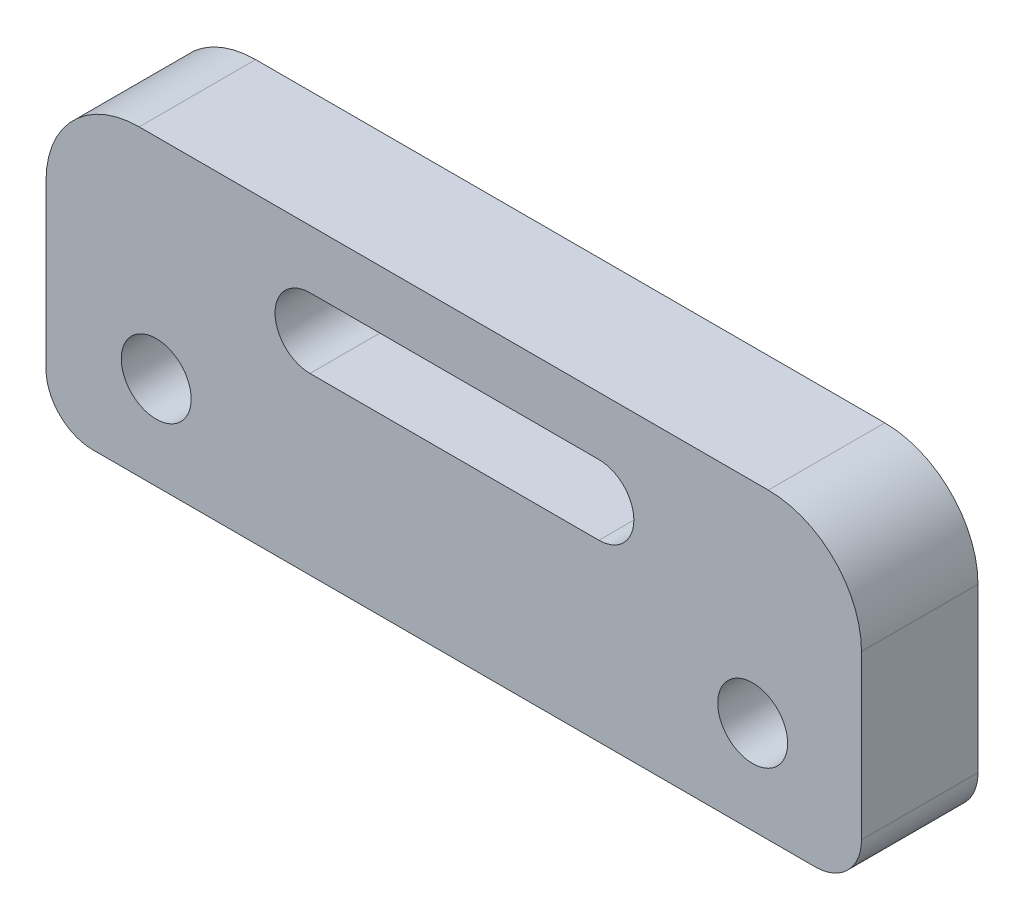
ISO-10303-21;
HEADER;
FILE_DESCRIPTION(('STEP AP214'),'2;1');
FILE_NAME('part.step','',(''),(''),'','','');
FILE_SCHEMA(('AUTOMOTIVE_DESIGN { 1 0 10303 214 1 1 1 1 }'));
ENDSEC;
DATA;
#1=APPLICATION_CONTEXT('core data for automotive mechanical design processes');
#2=APPLICATION_PROTOCOL_DEFINITION('international standard','automotive_design',2000,#1);
#3=PRODUCT_CONTEXT('',#1,'mechanical');
#4=PRODUCT('Part','Part','',(#3));
#5=PRODUCT_RELATED_PRODUCT_CATEGORY('part','',(#4));
#6=PRODUCT_DEFINITION_FORMATION('','',#4);
#7=PRODUCT_DEFINITION_CONTEXT('part definition',#1,'design');
#8=PRODUCT_DEFINITION('design','',#6,#7);
#9=PRODUCT_DEFINITION_SHAPE('','',#8);
#10=(LENGTH_UNIT() NAMED_UNIT(*) SI_UNIT(.MILLI.,.METRE.));
#11=(NAMED_UNIT(*) PLANE_ANGLE_UNIT() SI_UNIT($,.RADIAN.));
#12=(NAMED_UNIT(*) SI_UNIT($,.STERADIAN.) SOLID_ANGLE_UNIT());
#13=UNCERTAINTY_MEASURE_WITH_UNIT(LENGTH_MEASURE(1.E-05),#10,'distance_accuracy_value','');
#14=(GEOMETRIC_REPRESENTATION_CONTEXT(3) GLOBAL_UNCERTAINTY_ASSIGNED_CONTEXT((#13)) GLOBAL_UNIT_ASSIGNED_CONTEXT((#10,
#11,#12)) REPRESENTATION_CONTEXT('',''));
#15=CARTESIAN_POINT('',(0.,0.,0.));
#16=DIRECTION('',(0.,0.,1.));
#17=DIRECTION('',(1.,0.,0.));
#18=AXIS2_PLACEMENT_3D('',#15,#16,#17);
#19=CARTESIAN_POINT('',(16.2523833482388,-3.58106997579752,5.));
#20=DIRECTION('',(0.,0.,1.));
#21=DIRECTION('',(1.,0.,0.));
#22=AXIS2_PLACEMENT_3D('',#19,#20,#21);
#23=PLANE('',#22);
#24=CARTESIAN_POINT('',(13.5823831456504,-1.58016977928663,5.));
#25=DIRECTION('',(0.,0.,1.));
#26=DIRECTION('',(1.,0.,0.));
#27=AXIS2_PLACEMENT_3D('',#24,#25,#26);
#28=CIRCLE('',#27,1.5);
#29=CARTESIAN_POINT('',(15.0823831456504,-1.58016977928663,5.));
#30=VERTEX_POINT('',#29);
#31=EDGE_CURVE('E163',#30,#30,#28,.T.);
#32=ORIENTED_EDGE('',*,*,#31,.F.);
#33=EDGE_LOOP('',(#32));
#34=FACE_BOUND('',#33,.T.);
#35=CARTESIAN_POINT('',(16.2523833482388,-3.58106997579752,5.));
#36=DIRECTION('',(0.,0.,1.));
#37=DIRECTION('',(1.,0.,0.));
#38=AXIS2_PLACEMENT_3D('',#35,#36,#37);
#39=CIRCLE('',#38,2.00000000000002);
#40=CARTESIAN_POINT('',(16.3123831456501,-5.58016977928675,5.));
#41=VERTEX_POINT('',#40);
#42=CARTESIAN_POINT('',(18.2523831456504,-3.58016977928832,5.));
#43=VERTEX_POINT('',#42);
#44=EDGE_CURVE('E169',#41,#43,#39,.T.);
#45=ORIENTED_EDGE('',*,*,#44,.T.);
#46=DIRECTION('',(0.,1.,0.));
#47=VECTOR('',#46,1.);
#48=CARTESIAN_POINT('',(18.2523831456504,-3.58016977928832,5.));
#49=LINE('',#48,#47);
#50=CARTESIAN_POINT('',(18.2523831456504,3.4198302207103,5.));
#51=VERTEX_POINT('',#50);
#52=EDGE_CURVE('E172',#43,#51,#49,.T.);
#53=ORIENTED_EDGE('',*,*,#52,.T.);
#54=CARTESIAN_POINT('',(14.2523831456504,3.41983022071337,5.));
#55=DIRECTION('',(0.,0.,1.));
#56=DIRECTION('',(1.,0.,0.));
#57=AXIS2_PLACEMENT_3D('',#54,#55,#56);
#58=CIRCLE('',#57,4.);
#59=CARTESIAN_POINT('',(14.2523831456508,7.41983022071337,5.));
#60=VERTEX_POINT('',#59);
#61=EDGE_CURVE('E175',#51,#60,#58,.T.);
#62=ORIENTED_EDGE('',*,*,#61,.T.);
#63=DIRECTION('',(-1.,0.,0.));
#64=VECTOR('',#63,1.);
#65=CARTESIAN_POINT('',(-12.7476168543498,7.41983022071337,5.));
#66=LINE('',#65,#64);
#67=CARTESIAN_POINT('',(-12.7476168543498,7.41983022071337,5.));
#68=VERTEX_POINT('',#67);
#69=EDGE_CURVE('E177',#60,#68,#66,.T.);
#70=ORIENTED_EDGE('',*,*,#69,.T.);
#71=CARTESIAN_POINT('',(-12.7476168543498,3.41983022071335,5.));
#72=DIRECTION('',(0.,0.,1.));
#73=DIRECTION('',(1.,0.,0.));
#74=AXIS2_PLACEMENT_3D('',#71,#72,#73);
#75=CIRCLE('',#74,4.00000000000002);
#76=CARTESIAN_POINT('',(-16.7476168543498,3.41983022071336,5.));
#77=VERTEX_POINT('',#76);
#78=EDGE_CURVE('E179',#68,#77,#75,.T.);
#79=ORIENTED_EDGE('',*,*,#78,.T.);
#80=DIRECTION('',(0.,-1.,0.));
#81=VECTOR('',#80,1.);
#82=CARTESIAN_POINT('',(-16.7476168543498,3.41983022071336,5.));
#83=LINE('',#82,#81);
#84=CARTESIAN_POINT('',(-16.7476168543498,-3.58016977928677,5.));
#85=VERTEX_POINT('',#84);
#86=EDGE_CURVE('E181',#77,#85,#83,.T.);
#87=ORIENTED_EDGE('',*,*,#86,.T.);
#88=CARTESIAN_POINT('',(-14.7476168543498,-3.58016977928675,5.));
#89=DIRECTION('',(0.,0.,1.));
#90=DIRECTION('',(1.,0.,0.));
#91=AXIS2_PLACEMENT_3D('',#88,#89,#90);
#92=CIRCLE('',#91,2.);
#93=CARTESIAN_POINT('',(-14.7476168543493,-5.58016977928675,5.));
#94=VERTEX_POINT('',#93);
#95=EDGE_CURVE('E183',#85,#94,#92,.T.);
#96=ORIENTED_EDGE('',*,*,#95,.T.);
#97=DIRECTION('',(1.,0.,0.));
#98=VECTOR('',#97,1.);
#99=CARTESIAN_POINT('',(-14.7476168543493,-5.58016977928675,5.));
#100=LINE('',#99,#98);
#101=EDGE_CURVE('E185',#94,#41,#100,.T.);
#102=ORIENTED_EDGE('',*,*,#101,.T.);
#103=EDGE_LOOP('',(#45,#53,#62,#70,#79,#87,#96,#102));
#104=FACE_BOUND('',#103,.T.);
#105=CARTESIAN_POINT('',(-12.0176168543497,-1.58016977928663,5.));
#106=DIRECTION('',(0.,0.,1.));
#107=DIRECTION('',(1.,0.,0.));
#108=AXIS2_PLACEMENT_3D('',#105,#106,#107);
#109=CIRCLE('',#108,1.5);
#110=CARTESIAN_POINT('',(-10.5176168543497,-1.58016977928663,5.));
#111=VERTEX_POINT('',#110);
#112=EDGE_CURVE('E157',#111,#111,#109,.T.);
#113=ORIENTED_EDGE('',*,*,#112,.F.);
#114=EDGE_LOOP('',(#113));
#115=FACE_BOUND('',#114,.T.);
#116=DIRECTION('',(1.,0.,0.));
#117=VECTOR('',#116,1.);
#118=CARTESIAN_POINT('',(-5.41761685434961,1.91983022071337,5.));
#119=LINE('',#118,#117);
#120=CARTESIAN_POINT('',(-5.41761685434961,1.91983022071337,5.));
#121=VERTEX_POINT('',#120);
#122=CARTESIAN_POINT('',(6.98238314565039,1.91983022071351,5.));
#123=VERTEX_POINT('',#122);
#124=EDGE_CURVE('E129',#121,#123,#119,.T.);
#125=ORIENTED_EDGE('',*,*,#124,.F.);
#126=CARTESIAN_POINT('',(-5.41761685434961,3.41983022071337,5.));
#127=DIRECTION('',(0.,0.,1.));
#128=DIRECTION('',(1.,0.,0.));
#129=AXIS2_PLACEMENT_3D('',#126,#127,#128);
#130=CIRCLE('',#129,1.5);
#131=CARTESIAN_POINT('',(-5.41761685434961,4.91983022071337,5.));
#132=VERTEX_POINT('',#131);
#133=EDGE_CURVE('E121',#132,#121,#130,.T.);
#134=ORIENTED_EDGE('',*,*,#133,.F.);
#135=DIRECTION('',(-1.,0.,0.));
#136=VECTOR('',#135,1.);
#137=CARTESIAN_POINT('',(6.98238314565039,4.91983022071337,5.));
#138=LINE('',#137,#136);
#139=CARTESIAN_POINT('',(6.98238314565039,4.91983022071337,5.));
#140=VERTEX_POINT('',#139);
#141=EDGE_CURVE('E143',#140,#132,#138,.T.);
#142=ORIENTED_EDGE('',*,*,#141,.F.);
#143=CARTESIAN_POINT('',(6.98238314565039,3.41983022071337,5.));
#144=DIRECTION('',(0.,0.,1.));
#145=DIRECTION('',(1.,0.,0.));
#146=AXIS2_PLACEMENT_3D('',#143,#144,#145);
#147=CIRCLE('',#146,1.49999999999993);
#148=EDGE_CURVE('E141',#123,#140,#147,.T.);
#149=ORIENTED_EDGE('',*,*,#148,.F.);
#150=EDGE_LOOP('',(#125,#134,#142,#149));
#151=FACE_BOUND('',#150,.T.);
#152=ADVANCED_FACE('F32',(#34,#104,#115,#151),#23,.T.);
#153=CARTESIAN_POINT('',(16.2523833482388,-3.58106997579752,0.));
#154=DIRECTION('',(0.,0.,1.));
#155=DIRECTION('',(1.,0.,0.));
#156=AXIS2_PLACEMENT_3D('',#153,#154,#155);
#157=PLANE('',#156);
#158=CARTESIAN_POINT('',(-12.0176168543497,-1.58016977928663,0.));
#159=DIRECTION('',(0.,0.,1.));
#160=DIRECTION('',(1.,0.,0.));
#161=AXIS2_PLACEMENT_3D('',#158,#159,#160);
#162=CIRCLE('',#161,1.5);
#163=CARTESIAN_POINT('',(-10.5176168543497,-1.58016977928663,0.));
#164=VERTEX_POINT('',#163);
#165=EDGE_CURVE('E137',#164,#164,#162,.T.);
#166=ORIENTED_EDGE('',*,*,#165,.T.);
#167=EDGE_LOOP('',(#166));
#168=FACE_BOUND('',#167,.T.);
#169=CARTESIAN_POINT('',(13.5823831456504,-1.58016977928663,0.));
#170=DIRECTION('',(0.,0.,1.));
#171=DIRECTION('',(1.,0.,0.));
#172=AXIS2_PLACEMENT_3D('',#169,#170,#171);
#173=CIRCLE('',#172,1.5);
#174=CARTESIAN_POINT('',(15.0823831456504,-1.58016977928663,0.));
#175=VERTEX_POINT('',#174);
#176=EDGE_CURVE('E160',#175,#175,#173,.T.);
#177=ORIENTED_EDGE('',*,*,#176,.T.);
#178=EDGE_LOOP('',(#177));
#179=FACE_BOUND('',#178,.T.);
#180=CARTESIAN_POINT('',(16.2523833482388,-3.58106997579752,0.));
#181=DIRECTION('',(0.,0.,1.));
#182=DIRECTION('',(1.,0.,0.));
#183=AXIS2_PLACEMENT_3D('',#180,#181,#182);
#184=CIRCLE('',#183,2.00000000000002);
#185=CARTESIAN_POINT('',(16.3123831456501,-5.58016977928675,0.));
#186=VERTEX_POINT('',#185);
#187=CARTESIAN_POINT('',(18.2523831456504,-3.58016977928832,0.));
#188=VERTEX_POINT('',#187);
#189=EDGE_CURVE('E166',#186,#188,#184,.T.);
#190=ORIENTED_EDGE('',*,*,#189,.F.);
#191=DIRECTION('',(1.,0.,0.));
#192=VECTOR('',#191,1.);
#193=CARTESIAN_POINT('',(-14.7476168543493,-5.58016977928675,0.));
#194=LINE('',#193,#192);
#195=CARTESIAN_POINT('',(-14.7476168543493,-5.58016977928675,0.));
#196=VERTEX_POINT('',#195);
#197=EDGE_CURVE('E173',#196,#186,#194,.T.);
#198=ORIENTED_EDGE('',*,*,#197,.F.);
#199=CARTESIAN_POINT('',(-14.7476168543498,-3.58016977928675,0.));
#200=DIRECTION('',(0.,0.,1.));
#201=DIRECTION('',(1.,0.,0.));
#202=AXIS2_PLACEMENT_3D('',#199,#200,#201);
#203=CIRCLE('',#202,2.);
#204=CARTESIAN_POINT('',(-16.7476168543498,-3.58016977928677,0.));
#205=VERTEX_POINT('',#204);
#206=EDGE_CURVE('E200',#205,#196,#203,.T.);
#207=ORIENTED_EDGE('',*,*,#206,.F.);
#208=DIRECTION('',(0.,-1.,0.));
#209=VECTOR('',#208,1.);
#210=CARTESIAN_POINT('',(-16.7476168543498,3.41983022071336,0.));
#211=LINE('',#210,#209);
#212=CARTESIAN_POINT('',(-16.7476168543498,3.41983022071336,0.));
#213=VERTEX_POINT('',#212);
#214=EDGE_CURVE('E198',#213,#205,#211,.T.);
#215=ORIENTED_EDGE('',*,*,#214,.F.);
#216=CARTESIAN_POINT('',(-12.7476168543498,3.41983022071335,0.));
#217=DIRECTION('',(0.,0.,1.));
#218=DIRECTION('',(1.,0.,0.));
#219=AXIS2_PLACEMENT_3D('',#216,#217,#218);
#220=CIRCLE('',#219,4.00000000000002);
#221=CARTESIAN_POINT('',(-12.7476168543498,7.41983022071337,0.));
#222=VERTEX_POINT('',#221);
#223=EDGE_CURVE('E196',#222,#213,#220,.T.);
#224=ORIENTED_EDGE('',*,*,#223,.F.);
#225=DIRECTION('',(-1.,0.,0.));
#226=VECTOR('',#225,1.);
#227=CARTESIAN_POINT('',(-12.7476168543498,7.41983022071337,0.));
#228=LINE('',#227,#226);
#229=CARTESIAN_POINT('',(14.2523831456508,7.41983022071337,0.));
#230=VERTEX_POINT('',#229);
#231=EDGE_CURVE('E194',#230,#222,#228,.T.);
#232=ORIENTED_EDGE('',*,*,#231,.F.);
#233=CARTESIAN_POINT('',(14.2523831456504,3.41983022071337,0.));
#234=DIRECTION('',(0.,0.,1.));
#235=DIRECTION('',(1.,0.,0.));
#236=AXIS2_PLACEMENT_3D('',#233,#234,#235);
#237=CIRCLE('',#236,4.);
#238=CARTESIAN_POINT('',(18.2523831456504,3.4198302207103,0.));
#239=VERTEX_POINT('',#238);
#240=EDGE_CURVE('E192',#239,#230,#237,.T.);
#241=ORIENTED_EDGE('',*,*,#240,.F.);
#242=DIRECTION('',(0.,1.,0.));
#243=VECTOR('',#242,1.);
#244=CARTESIAN_POINT('',(18.2523831456504,-3.58016977928832,0.));
#245=LINE('',#244,#243);
#246=EDGE_CURVE('E190',#188,#239,#245,.T.);
#247=ORIENTED_EDGE('',*,*,#246,.F.);
#248=EDGE_LOOP('',(#190,#198,#207,#215,#224,#232,#241,#247));
#249=FACE_BOUND('',#248,.T.);
#250=CARTESIAN_POINT('',(-5.41761685434961,3.41983022071337,0.));
#251=DIRECTION('',(0.,0.,1.));
#252=DIRECTION('',(1.,0.,0.));
#253=AXIS2_PLACEMENT_3D('',#250,#251,#252);
#254=CIRCLE('',#253,1.5);
#255=CARTESIAN_POINT('',(-5.4176168543496,4.91983022071337,0.));
#256=VERTEX_POINT('',#255);
#257=CARTESIAN_POINT('',(-5.41761685434961,1.91983022071337,0.));
#258=VERTEX_POINT('',#257);
#259=EDGE_CURVE('E55',#256,#258,#254,.T.);
#260=ORIENTED_EDGE('',*,*,#259,.T.);
#261=DIRECTION('',(1.,0.,0.));
#262=VECTOR('',#261,1.);
#263=CARTESIAN_POINT('',(-5.41761685434961,1.91983022071337,0.));
#264=LINE('',#263,#262);
#265=CARTESIAN_POINT('',(6.98238314565039,1.91983022071351,0.));
#266=VERTEX_POINT('',#265);
#267=EDGE_CURVE('E136',#258,#266,#264,.T.);
#268=ORIENTED_EDGE('',*,*,#267,.T.);
#269=CARTESIAN_POINT('',(6.98238314565039,3.41983022071337,0.));
#270=DIRECTION('',(0.,0.,1.));
#271=DIRECTION('',(1.,0.,0.));
#272=AXIS2_PLACEMENT_3D('',#269,#270,#271);
#273=CIRCLE('',#272,1.49999999999993);
#274=CARTESIAN_POINT('',(6.98238314565039,4.91983022071331,0.));
#275=VERTEX_POINT('',#274);
#276=EDGE_CURVE('E149',#266,#275,#273,.T.);
#277=ORIENTED_EDGE('',*,*,#276,.T.);
#278=DIRECTION('',(-1.,0.,0.));
#279=VECTOR('',#278,1.);
#280=CARTESIAN_POINT('',(6.98238314565039,4.91983022071337,0.));
#281=LINE('',#280,#279);
#282=EDGE_CURVE('E130',#275,#256,#281,.T.);
#283=ORIENTED_EDGE('',*,*,#282,.T.);
#284=EDGE_LOOP('',(#260,#268,#277,#283));
#285=FACE_BOUND('',#284,.T.);
#286=ADVANCED_FACE('F230',(#168,#179,#249,#285),#157,.F.);
#287=CARTESIAN_POINT('',(16.2523833482388,-3.58106997579752,5.));
#288=DIRECTION('',(0.,0.,-1.));
#289=DIRECTION('',(-1.,0.,0.));
#290=AXIS2_PLACEMENT_3D('',#287,#288,#289);
#291=CYLINDRICAL_SURFACE('',#290,2.00000000000002);
#292=ORIENTED_EDGE('',*,*,#189,.T.);
#293=DIRECTION('',(0.,0.,-1.));
#294=VECTOR('',#293,1.);
#295=CARTESIAN_POINT('',(18.2523831456504,-3.58016977928832,5.));
#296=LINE('',#295,#294);
#297=EDGE_CURVE('E11',#43,#188,#296,.T.);
#298=ORIENTED_EDGE('',*,*,#297,.F.);
#299=ORIENTED_EDGE('',*,*,#44,.F.);
#300=DIRECTION('',(0.,0.,-1.));
#301=VECTOR('',#300,1.);
#302=CARTESIAN_POINT('',(16.3123831456501,-5.58016977928675,5.));
#303=LINE('',#302,#301);
#304=EDGE_CURVE('E187',#41,#186,#303,.T.);
#305=ORIENTED_EDGE('',*,*,#304,.T.);
#306=EDGE_LOOP('',(#292,#298,#299,#305));
#307=FACE_BOUND('',#306,.T.);
#308=ADVANCED_FACE('F34',(#307),#291,.T.);
#309=CARTESIAN_POINT('',(18.2523831456504,-3.58016977928832,5.));
#310=DIRECTION('',(-1.,0.,0.));
#311=DIRECTION('',(0.,0.,1.));
#312=AXIS2_PLACEMENT_3D('',#309,#310,#311);
#313=PLANE('',#312);
#314=ORIENTED_EDGE('',*,*,#246,.T.);
#315=DIRECTION('',(0.,0.,-1.));
#316=VECTOR('',#315,1.);
#317=CARTESIAN_POINT('',(18.2523831456504,3.4198302207103,5.));
#318=LINE('',#317,#316);
#319=EDGE_CURVE('E40',#51,#239,#318,.T.);
#320=ORIENTED_EDGE('',*,*,#319,.F.);
#321=ORIENTED_EDGE('',*,*,#52,.F.);
#322=ORIENTED_EDGE('',*,*,#297,.T.);
#323=EDGE_LOOP('',(#314,#320,#321,#322));
#324=FACE_BOUND('',#323,.T.);
#325=ADVANCED_FACE('F248',(#324),#313,.F.);
#326=CARTESIAN_POINT('',(14.2523831456504,3.41983022071337,5.));
#327=DIRECTION('',(0.,0.,-1.));
#328=DIRECTION('',(-1.,0.,0.));
#329=AXIS2_PLACEMENT_3D('',#326,#327,#328);
#330=CYLINDRICAL_SURFACE('',#329,4.);
#331=ORIENTED_EDGE('',*,*,#240,.T.);
#332=DIRECTION('',(0.,0.,-1.));
#333=VECTOR('',#332,1.);
#334=CARTESIAN_POINT('',(14.2523831456508,7.41983022071337,5.));
#335=LINE('',#334,#333);
#336=EDGE_CURVE('E217',#60,#230,#335,.T.);
#337=ORIENTED_EDGE('',*,*,#336,.F.);
#338=ORIENTED_EDGE('',*,*,#61,.F.);
#339=ORIENTED_EDGE('',*,*,#319,.T.);
#340=EDGE_LOOP('',(#331,#337,#338,#339));
#341=FACE_BOUND('',#340,.T.);
#342=ADVANCED_FACE('F224',(#341),#330,.T.);
#343=CARTESIAN_POINT('',(-12.7476168543498,7.41983022071337,5.));
#344=DIRECTION('',(0.,-1.,0.));
#345=DIRECTION('',(1.,0.,0.));
#346=AXIS2_PLACEMENT_3D('',#343,#344,#345);
#347=PLANE('',#346);
#348=ORIENTED_EDGE('',*,*,#231,.T.);
#349=DIRECTION('',(0.,0.,-1.));
#350=VECTOR('',#349,1.);
#351=CARTESIAN_POINT('',(-12.7476168543498,7.41983022071337,5.));
#352=LINE('',#351,#350);
#353=EDGE_CURVE('E214',#68,#222,#352,.T.);
#354=ORIENTED_EDGE('',*,*,#353,.F.);
#355=ORIENTED_EDGE('',*,*,#69,.F.);
#356=ORIENTED_EDGE('',*,*,#336,.T.);
#357=EDGE_LOOP('',(#348,#354,#355,#356));
#358=FACE_BOUND('',#357,.T.);
#359=ADVANCED_FACE('F236',(#358),#347,.F.);
#360=CARTESIAN_POINT('',(-12.7476168543498,3.41983022071335,5.));
#361=DIRECTION('',(0.,0.,-1.));
#362=DIRECTION('',(-1.,0.,0.));
#363=AXIS2_PLACEMENT_3D('',#360,#361,#362);
#364=CYLINDRICAL_SURFACE('',#363,4.00000000000002);
#365=ORIENTED_EDGE('',*,*,#223,.T.);
#366=DIRECTION('',(0.,0.,-1.));
#367=VECTOR('',#366,1.);
#368=CARTESIAN_POINT('',(-16.7476168543498,3.41983022071336,5.));
#369=LINE('',#368,#367);
#370=EDGE_CURVE('E211',#77,#213,#369,.T.);
#371=ORIENTED_EDGE('',*,*,#370,.F.);
#372=ORIENTED_EDGE('',*,*,#78,.F.);
#373=ORIENTED_EDGE('',*,*,#353,.T.);
#374=EDGE_LOOP('',(#365,#371,#372,#373));
#375=FACE_BOUND('',#374,.T.);
#376=ADVANCED_FACE('F240',(#375),#364,.T.);
#377=CARTESIAN_POINT('',(-16.7476168543498,3.41983022071336,5.));
#378=DIRECTION('',(1.,0.,0.));
#379=DIRECTION('',(0.,0.,-1.));
#380=AXIS2_PLACEMENT_3D('',#377,#378,#379);
#381=PLANE('',#380);
#382=ORIENTED_EDGE('',*,*,#214,.T.);
#383=DIRECTION('',(0.,0.,-1.));
#384=VECTOR('',#383,1.);
#385=CARTESIAN_POINT('',(-16.7476168543498,-3.58016977928677,5.));
#386=LINE('',#385,#384);
#387=EDGE_CURVE('E208',#85,#205,#386,.T.);
#388=ORIENTED_EDGE('',*,*,#387,.F.);
#389=ORIENTED_EDGE('',*,*,#86,.F.);
#390=ORIENTED_EDGE('',*,*,#370,.T.);
#391=EDGE_LOOP('',(#382,#388,#389,#390));
#392=FACE_BOUND('',#391,.T.);
#393=ADVANCED_FACE('F261',(#392),#381,.F.);
#394=CARTESIAN_POINT('',(-14.7476168543498,-3.58016977928675,5.));
#395=DIRECTION('',(0.,0.,-1.));
#396=DIRECTION('',(-1.,0.,0.));
#397=AXIS2_PLACEMENT_3D('',#394,#395,#396);
#398=CYLINDRICAL_SURFACE('',#397,2.);
#399=ORIENTED_EDGE('',*,*,#206,.T.);
#400=DIRECTION('',(0.,0.,-1.));
#401=VECTOR('',#400,1.);
#402=CARTESIAN_POINT('',(-14.7476168543493,-5.58016977928675,5.));
#403=LINE('',#402,#401);
#404=EDGE_CURVE('E205',#94,#196,#403,.T.);
#405=ORIENTED_EDGE('',*,*,#404,.F.);
#406=ORIENTED_EDGE('',*,*,#95,.F.);
#407=ORIENTED_EDGE('',*,*,#387,.T.);
#408=EDGE_LOOP('',(#399,#405,#406,#407));
#409=FACE_BOUND('',#408,.T.);
#410=ADVANCED_FACE('F259',(#409),#398,.T.);
#411=CARTESIAN_POINT('',(-14.7476168543493,-5.58016977928675,5.));
#412=DIRECTION('',(0.,1.,0.));
#413=DIRECTION('',(-1.,0.,0.));
#414=AXIS2_PLACEMENT_3D('',#411,#412,#413);
#415=PLANE('',#414);
#416=ORIENTED_EDGE('',*,*,#197,.T.);
#417=ORIENTED_EDGE('',*,*,#304,.F.);
#418=ORIENTED_EDGE('',*,*,#101,.F.);
#419=ORIENTED_EDGE('',*,*,#404,.T.);
#420=EDGE_LOOP('',(#416,#417,#418,#419));
#421=FACE_BOUND('',#420,.T.);
#422=ADVANCED_FACE('F254',(#421),#415,.F.);
#423=CARTESIAN_POINT('',(13.5823831456504,-1.58016977928663,5.));
#424=DIRECTION('',(0.,0.,-1.));
#425=DIRECTION('',(-1.,0.,0.));
#426=AXIS2_PLACEMENT_3D('',#423,#424,#425);
#427=CYLINDRICAL_SURFACE('',#426,1.5);
#428=ORIENTED_EDGE('',*,*,#31,.T.);
#429=EDGE_LOOP('',(#428));
#430=FACE_BOUND('',#429,.T.);
#431=ORIENTED_EDGE('',*,*,#176,.F.);
#432=EDGE_LOOP('',(#431));
#433=FACE_BOUND('',#432,.T.);
#434=ADVANCED_FACE('F280',(#430,#433),#427,.F.);
#435=CARTESIAN_POINT('',(-12.0176168543497,-1.58016977928663,5.));
#436=DIRECTION('',(0.,0.,-1.));
#437=DIRECTION('',(-1.,0.,0.));
#438=AXIS2_PLACEMENT_3D('',#435,#436,#437);
#439=CYLINDRICAL_SURFACE('',#438,1.5);
#440=ORIENTED_EDGE('',*,*,#112,.T.);
#441=EDGE_LOOP('',(#440));
#442=FACE_BOUND('',#441,.T.);
#443=ORIENTED_EDGE('',*,*,#165,.F.);
#444=EDGE_LOOP('',(#443));
#445=FACE_BOUND('',#444,.T.);
#446=ADVANCED_FACE('F287',(#442,#445),#439,.F.);
#447=CARTESIAN_POINT('',(-5.41761685434961,3.41983022071337,5.));
#448=DIRECTION('',(0.,0.,-1.));
#449=DIRECTION('',(-1.,0.,0.));
#450=AXIS2_PLACEMENT_3D('',#447,#448,#449);
#451=CYLINDRICAL_SURFACE('',#450,1.5);
#452=ORIENTED_EDGE('',*,*,#259,.F.);
#453=DIRECTION('',(0.,0.,-1.));
#454=VECTOR('',#453,1.);
#455=CARTESIAN_POINT('',(-5.41761685434961,4.91983022071337,5.));
#456=LINE('',#455,#454);
#457=EDGE_CURVE('E125',#132,#256,#456,.T.);
#458=ORIENTED_EDGE('',*,*,#457,.F.);
#459=ORIENTED_EDGE('',*,*,#133,.T.);
#460=DIRECTION('',(0.,0.,-1.));
#461=VECTOR('',#460,1.);
#462=CARTESIAN_POINT('',(-5.41761685434961,1.91983022071337,5.));
#463=LINE('',#462,#461);
#464=EDGE_CURVE('E124',#121,#258,#463,.T.);
#465=ORIENTED_EDGE('',*,*,#464,.T.);
#466=EDGE_LOOP('',(#452,#458,#459,#465));
#467=FACE_BOUND('',#466,.T.);
#468=ADVANCED_FACE('F123',(#467),#451,.F.);
#469=CARTESIAN_POINT('',(-5.41761685434961,1.91983022071337,5.));
#470=DIRECTION('',(0.,1.,0.));
#471=DIRECTION('',(-1.,0.,0.));
#472=AXIS2_PLACEMENT_3D('',#469,#470,#471);
#473=PLANE('',#472);
#474=ORIENTED_EDGE('',*,*,#267,.F.);
#475=ORIENTED_EDGE('',*,*,#464,.F.);
#476=ORIENTED_EDGE('',*,*,#124,.T.);
#477=DIRECTION('',(0.,0.,-1.));
#478=VECTOR('',#477,1.);
#479=CARTESIAN_POINT('',(6.98238314565039,1.91983022071351,5.));
#480=LINE('',#479,#478);
#481=EDGE_CURVE('E138',#123,#266,#480,.T.);
#482=ORIENTED_EDGE('',*,*,#481,.T.);
#483=EDGE_LOOP('',(#474,#475,#476,#482));
#484=FACE_BOUND('',#483,.T.);
#485=ADVANCED_FACE('F133',(#484),#473,.T.);
#486=CARTESIAN_POINT('',(6.98238314565039,3.41983022071337,5.));
#487=DIRECTION('',(0.,0.,-1.));
#488=DIRECTION('',(-1.,0.,0.));
#489=AXIS2_PLACEMENT_3D('',#486,#487,#488);
#490=CYLINDRICAL_SURFACE('',#489,1.49999999999993);
#491=ORIENTED_EDGE('',*,*,#276,.F.);
#492=ORIENTED_EDGE('',*,*,#481,.F.);
#493=ORIENTED_EDGE('',*,*,#148,.T.);
#494=DIRECTION('',(0.,0.,-1.));
#495=VECTOR('',#494,1.);
#496=CARTESIAN_POINT('',(6.98238314565039,4.91983022071331,5.));
#497=LINE('',#496,#495);
#498=EDGE_CURVE('E47',#140,#275,#497,.T.);
#499=ORIENTED_EDGE('',*,*,#498,.T.);
#500=EDGE_LOOP('',(#491,#492,#493,#499));
#501=FACE_BOUND('',#500,.T.);
#502=ADVANCED_FACE('F304',(#501),#490,.F.);
#503=CARTESIAN_POINT('',(6.98238314565039,4.91983022071337,5.));
#504=DIRECTION('',(0.,-1.,0.));
#505=DIRECTION('',(1.,0.,0.));
#506=AXIS2_PLACEMENT_3D('',#503,#504,#505);
#507=PLANE('',#506);
#508=ORIENTED_EDGE('',*,*,#282,.F.);
#509=ORIENTED_EDGE('',*,*,#498,.F.);
#510=ORIENTED_EDGE('',*,*,#141,.T.);
#511=ORIENTED_EDGE('',*,*,#457,.T.);
#512=EDGE_LOOP('',(#508,#509,#510,#511));
#513=FACE_BOUND('',#512,.T.);
#514=ADVANCED_FACE('F307',(#513),#507,.T.);
#515=CLOSED_SHELL('',(#152,#286,#308,#325,#342,#359,#376,#393,#410,#422,#434,#446,#468,#485,
#502,#514));
#516=MANIFOLD_SOLID_BREP('B2',#515);
#517=ADVANCED_BREP_SHAPE_REPRESENTATION('',(#18,#516),#14);
#518=SHAPE_DEFINITION_REPRESENTATION(#9,#517);
ENDSEC;
END-ISO-10303-21;
